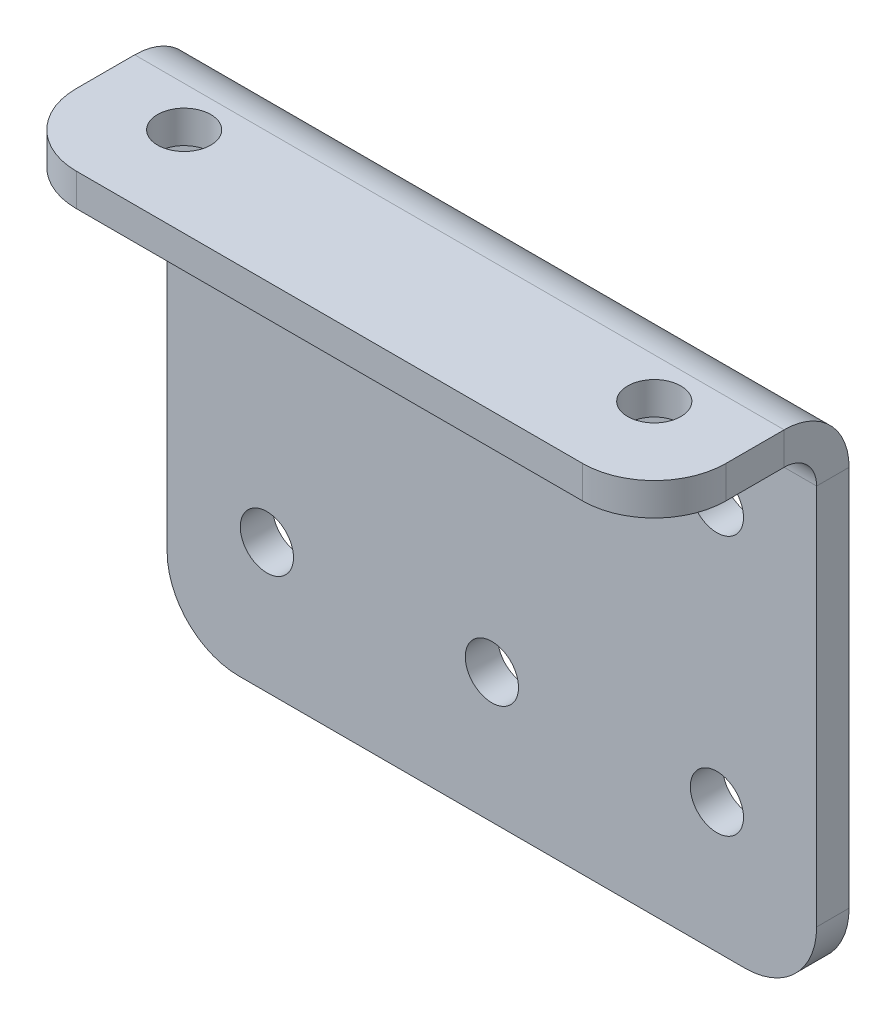
ISO-10303-21;
HEADER;
FILE_DESCRIPTION(('STEP AP214'),'2;1');
FILE_NAME('part.step','',(''),(''),'','','');
FILE_SCHEMA(('AUTOMOTIVE_DESIGN { 1 0 10303 214 1 1 1 1 }'));
ENDSEC;
DATA;
#1=APPLICATION_CONTEXT('core data for automotive mechanical design processes');
#2=APPLICATION_PROTOCOL_DEFINITION('international standard','automotive_design',2000,#1);
#3=PRODUCT_CONTEXT('',#1,'mechanical');
#4=PRODUCT('Part','Part','',(#3));
#5=PRODUCT_RELATED_PRODUCT_CATEGORY('part','',(#4));
#6=PRODUCT_DEFINITION_FORMATION('','',#4);
#7=PRODUCT_DEFINITION_CONTEXT('part definition',#1,'design');
#8=PRODUCT_DEFINITION('design','',#6,#7);
#9=PRODUCT_DEFINITION_SHAPE('','',#8);
#10=(LENGTH_UNIT() NAMED_UNIT(*) SI_UNIT(.MILLI.,.METRE.));
#11=(NAMED_UNIT(*) PLANE_ANGLE_UNIT() SI_UNIT($,.RADIAN.));
#12=(NAMED_UNIT(*) SI_UNIT($,.STERADIAN.) SOLID_ANGLE_UNIT());
#13=UNCERTAINTY_MEASURE_WITH_UNIT(LENGTH_MEASURE(1.E-05),#10,'distance_accuracy_value','');
#14=(GEOMETRIC_REPRESENTATION_CONTEXT(3) GLOBAL_UNCERTAINTY_ASSIGNED_CONTEXT((#13)) GLOBAL_UNIT_ASSIGNED_CONTEXT((#10,
#11,#12)) REPRESENTATION_CONTEXT('',''));
#15=CARTESIAN_POINT('',(0.,0.,0.));
#16=DIRECTION('',(0.,0.,1.));
#17=DIRECTION('',(1.,0.,0.));
#18=AXIS2_PLACEMENT_3D('',#15,#16,#17);
#19=CARTESIAN_POINT('',(-393.7,22.104996867082,0.));
#20=DIRECTION('',(1.,0.,0.));
#21=DIRECTION('',(0.,0.,-1.));
#22=AXIS2_PLACEMENT_3D('',#19,#20,#21);
#23=PLANE('',#22);
#24=DIRECTION('',(0.,-1.,0.));
#25=VECTOR('',#24,1.);
#26=CARTESIAN_POINT('',(-393.7,22.104996867082,6.35));
#27=LINE('',#26,#25);
#28=CARTESIAN_POINT('',(-393.7,25.279996867082,6.35));
#29=VERTEX_POINT('',#28);
#30=CARTESIAN_POINT('',(-393.7,22.104996867082,6.35));
#31=VERTEX_POINT('',#30);
#32=EDGE_CURVE('E11',#29,#31,#27,.T.);
#33=ORIENTED_EDGE('',*,*,#32,.F.);
#34=DIRECTION('',(0.,0.,1.));
#35=VECTOR('',#34,1.);
#36=CARTESIAN_POINT('',(-393.7,25.279996867082,0.));
#37=LINE('',#36,#35);
#38=CARTESIAN_POINT('',(-393.7,25.279996867082,12.05));
#39=VERTEX_POINT('',#38);
#40=EDGE_CURVE('E113',#39,#29,#37,.F.);
#41=ORIENTED_EDGE('',*,*,#40,.F.);
#42=DIRECTION('',(0.,-1.,0.));
#43=VECTOR('',#42,1.);
#44=CARTESIAN_POINT('',(-393.7,22.104996867082,12.05));
#45=LINE('',#44,#43);
#46=CARTESIAN_POINT('',(-393.7,22.104996867082,12.05));
#47=VERTEX_POINT('',#46);
#48=EDGE_CURVE('E60',#39,#47,#45,.T.);
#49=ORIENTED_EDGE('',*,*,#48,.T.);
#50=DIRECTION('',(0.,0.,-1.));
#51=VECTOR('',#50,1.);
#52=CARTESIAN_POINT('',(-393.7,22.104996867082,0.));
#53=LINE('',#52,#51);
#54=EDGE_CURVE('E116',#47,#31,#53,.T.);
#55=ORIENTED_EDGE('',*,*,#54,.T.);
#56=EDGE_LOOP('',(#33,#41,#49,#55));
#57=FACE_BOUND('',#56,.T.);
#58=ADVANCED_FACE('F49',(#57),#23,.T.);
#59=CARTESIAN_POINT('',(-400.7,22.104996867082,12.05));
#60=DIRECTION('',(0.,1.,0.));
#61=DIRECTION('',(-1.,0.,0.));
#62=AXIS2_PLACEMENT_3D('',#59,#60,#61);
#63=CYLINDRICAL_SURFACE('',#62,7.);
#64=ORIENTED_EDGE('',*,*,#48,.F.);
#65=CARTESIAN_POINT('',(-400.7,25.279996867082,12.05));
#66=DIRECTION('',(0.,1.,0.));
#67=DIRECTION('',(-1.,0.,0.));
#68=AXIS2_PLACEMENT_3D('',#65,#66,#67);
#69=CIRCLE('',#68,7.);
#70=CARTESIAN_POINT('',(-400.7,25.279996867082,19.05));
#71=VERTEX_POINT('',#70);
#72=EDGE_CURVE('E142',#39,#71,#69,.F.);
#73=ORIENTED_EDGE('',*,*,#72,.T.);
#74=DIRECTION('',(0.,-1.,0.));
#75=VECTOR('',#74,1.);
#76=CARTESIAN_POINT('',(-400.7,22.104996867082,19.05));
#77=LINE('',#76,#75);
#78=CARTESIAN_POINT('',(-400.7,22.104996867082,19.05));
#79=VERTEX_POINT('',#78);
#80=EDGE_CURVE('E195',#71,#79,#77,.T.);
#81=ORIENTED_EDGE('',*,*,#80,.T.);
#82=CARTESIAN_POINT('',(-400.7,22.104996867082,12.05));
#83=DIRECTION('',(0.,1.,0.));
#84=DIRECTION('',(-1.,0.,0.));
#85=AXIS2_PLACEMENT_3D('',#82,#83,#84);
#86=CIRCLE('',#85,7.);
#87=EDGE_CURVE('E281',#47,#79,#86,.F.);
#88=ORIENTED_EDGE('',*,*,#87,.F.);
#89=EDGE_LOOP('',(#64,#73,#81,#88));
#90=FACE_BOUND('',#89,.T.);
#91=ADVANCED_FACE('F276',(#90),#63,.T.);
#92=CARTESIAN_POINT('',(-457.2,22.104996867082,19.05));
#93=DIRECTION('',(0.,0.,1.));
#94=DIRECTION('',(1.,0.,0.));
#95=AXIS2_PLACEMENT_3D('',#92,#93,#94);
#96=PLANE('',#95);
#97=ORIENTED_EDGE('',*,*,#80,.F.);
#98=DIRECTION('',(-1.,0.,0.));
#99=VECTOR('',#98,1.);
#100=CARTESIAN_POINT('',(0.,25.279996867082,19.05));
#101=LINE('',#100,#99);
#102=CARTESIAN_POINT('',(-450.2,25.279996867082,19.05));
#103=VERTEX_POINT('',#102);
#104=EDGE_CURVE('E272',#103,#71,#101,.F.);
#105=ORIENTED_EDGE('',*,*,#104,.F.);
#106=DIRECTION('',(0.,-1.,0.));
#107=VECTOR('',#106,1.);
#108=CARTESIAN_POINT('',(-450.2,22.104996867082,19.05));
#109=LINE('',#108,#107);
#110=CARTESIAN_POINT('',(-450.2,22.104996867082,19.05));
#111=VERTEX_POINT('',#110);
#112=EDGE_CURVE('E191',#103,#111,#109,.T.);
#113=ORIENTED_EDGE('',*,*,#112,.T.);
#114=DIRECTION('',(1.,0.,0.));
#115=VECTOR('',#114,1.);
#116=CARTESIAN_POINT('',(-457.2,22.104996867082,19.05));
#117=LINE('',#116,#115);
#118=EDGE_CURVE('E295',#111,#79,#117,.T.);
#119=ORIENTED_EDGE('',*,*,#118,.T.);
#120=EDGE_LOOP('',(#97,#105,#113,#119));
#121=FACE_BOUND('',#120,.T.);
#122=ADVANCED_FACE('F395',(#121),#96,.T.);
#123=CARTESIAN_POINT('',(-450.2,22.104996867082,12.05));
#124=DIRECTION('',(0.,1.,0.));
#125=DIRECTION('',(-1.,0.,0.));
#126=AXIS2_PLACEMENT_3D('',#123,#124,#125);
#127=CYLINDRICAL_SURFACE('',#126,7.);
#128=ORIENTED_EDGE('',*,*,#112,.F.);
#129=CARTESIAN_POINT('',(-450.2,25.279996867082,12.05));
#130=DIRECTION('',(0.,1.,0.));
#131=DIRECTION('',(-1.,0.,0.));
#132=AXIS2_PLACEMENT_3D('',#129,#130,#131);
#133=CIRCLE('',#132,7.);
#134=CARTESIAN_POINT('',(-457.2,25.279996867082,12.05));
#135=VERTEX_POINT('',#134);
#136=EDGE_CURVE('E268',#103,#135,#133,.F.);
#137=ORIENTED_EDGE('',*,*,#136,.T.);
#138=DIRECTION('',(0.,-1.,0.));
#139=VECTOR('',#138,1.);
#140=CARTESIAN_POINT('',(-457.2,22.104996867082,12.05));
#141=LINE('',#140,#139);
#142=CARTESIAN_POINT('',(-457.2,22.104996867082,12.05));
#143=VERTEX_POINT('',#142);
#144=EDGE_CURVE('E187',#135,#143,#141,.T.);
#145=ORIENTED_EDGE('',*,*,#144,.T.);
#146=CARTESIAN_POINT('',(-450.2,22.104996867082,12.05));
#147=DIRECTION('',(0.,1.,0.));
#148=DIRECTION('',(-1.,0.,0.));
#149=AXIS2_PLACEMENT_3D('',#146,#147,#148);
#150=CIRCLE('',#149,7.);
#151=EDGE_CURVE('E304',#111,#143,#150,.F.);
#152=ORIENTED_EDGE('',*,*,#151,.F.);
#153=EDGE_LOOP('',(#128,#137,#145,#152));
#154=FACE_BOUND('',#153,.T.);
#155=ADVANCED_FACE('F357',(#154),#127,.T.);
#156=CARTESIAN_POINT('',(-457.2,22.104996867082,0.));
#157=DIRECTION('',(-1.,0.,0.));
#158=DIRECTION('',(0.,0.,1.));
#159=AXIS2_PLACEMENT_3D('',#156,#157,#158);
#160=PLANE('',#159);
#161=ORIENTED_EDGE('',*,*,#144,.F.);
#162=DIRECTION('',(0.,0.,1.));
#163=VECTOR('',#162,1.);
#164=CARTESIAN_POINT('',(-457.2,25.279996867082,0.));
#165=LINE('',#164,#163);
#166=CARTESIAN_POINT('',(-457.2,25.279996867082,6.35));
#167=VERTEX_POINT('',#166);
#168=EDGE_CURVE('E264',#167,#135,#165,.T.);
#169=ORIENTED_EDGE('',*,*,#168,.F.);
#170=DIRECTION('',(0.,-1.,0.));
#171=VECTOR('',#170,1.);
#172=CARTESIAN_POINT('',(-457.2,22.104996867082,6.35));
#173=LINE('',#172,#171);
#174=CARTESIAN_POINT('',(-457.2,22.104996867082,6.35));
#175=VERTEX_POINT('',#174);
#176=EDGE_CURVE('E183',#167,#175,#173,.T.);
#177=ORIENTED_EDGE('',*,*,#176,.T.);
#178=DIRECTION('',(0.,0.,1.));
#179=VECTOR('',#178,1.);
#180=CARTESIAN_POINT('',(-457.2,22.104996867082,0.));
#181=LINE('',#180,#179);
#182=EDGE_CURVE('E308',#175,#143,#181,.T.);
#183=ORIENTED_EDGE('',*,*,#182,.T.);
#184=EDGE_LOOP('',(#161,#169,#177,#183));
#185=FACE_BOUND('',#184,.T.);
#186=ADVANCED_FACE('F350',(#185),#160,.T.);
#187=CARTESIAN_POINT('',(-457.2,18.929996867082,6.35));
#188=DIRECTION('',(1.,0.,0.));
#189=DIRECTION('',(0.,0.,-1.));
#190=AXIS2_PLACEMENT_3D('',#187,#188,#189);
#191=PLANE('',#190);
#192=ORIENTED_EDGE('',*,*,#176,.F.);
#193=CARTESIAN_POINT('',(-457.2,18.929996867082,6.35));
#194=DIRECTION('',(-1.,0.,0.));
#195=DIRECTION('',(0.,-1.,0.));
#196=AXIS2_PLACEMENT_3D('',#193,#194,#195);
#197=CIRCLE('',#196,6.35);
#198=CARTESIAN_POINT('',(-457.2,18.9299968670821,0.));
#199=VERTEX_POINT('',#198);
#200=EDGE_CURVE('E130',#167,#199,#197,.T.);
#201=ORIENTED_EDGE('',*,*,#200,.T.);
#202=DIRECTION('',(0.,0.,1.));
#203=VECTOR('',#202,1.);
#204=CARTESIAN_POINT('',(-457.2,18.929996867082,3.175));
#205=LINE('',#204,#203);
#206=CARTESIAN_POINT('',(-457.2,18.929996867082,3.175));
#207=VERTEX_POINT('',#206);
#208=EDGE_CURVE('E180',#199,#207,#205,.T.);
#209=ORIENTED_EDGE('',*,*,#208,.T.);
#210=CARTESIAN_POINT('',(-457.2,18.929996867082,6.35));
#211=DIRECTION('',(-1.,0.,0.));
#212=DIRECTION('',(0.,0.,1.));
#213=AXIS2_PLACEMENT_3D('',#210,#211,#212);
#214=CIRCLE('',#213,3.175);
#215=EDGE_CURVE('E340',#175,#207,#214,.T.);
#216=ORIENTED_EDGE('',*,*,#215,.F.);
#217=EDGE_LOOP('',(#192,#201,#209,#216));
#218=FACE_BOUND('',#217,.T.);
#219=ADVANCED_FACE('F347',(#218),#191,.F.);
#220=CARTESIAN_POINT('',(-457.2,-25.4,3.175));
#221=DIRECTION('',(1.,0.,0.));
#222=DIRECTION('',(0.,-1.,0.));
#223=AXIS2_PLACEMENT_3D('',#220,#221,#222);
#224=PLANE('',#223);
#225=ORIENTED_EDGE('',*,*,#208,.F.);
#226=DIRECTION('',(0.,1.,0.));
#227=VECTOR('',#226,1.);
#228=CARTESIAN_POINT('',(-457.2,0.,0.));
#229=LINE('',#228,#227);
#230=CARTESIAN_POINT('',(-457.2,-18.4,0.));
#231=VERTEX_POINT('',#230);
#232=EDGE_CURVE('E261',#199,#231,#229,.F.);
#233=ORIENTED_EDGE('',*,*,#232,.T.);
#234=DIRECTION('',(0.,0.,1.));
#235=VECTOR('',#234,1.);
#236=CARTESIAN_POINT('',(-457.2,-18.4,3.175));
#237=LINE('',#236,#235);
#238=CARTESIAN_POINT('',(-457.2,-18.4,3.175));
#239=VERTEX_POINT('',#238);
#240=EDGE_CURVE('E176',#231,#239,#237,.T.);
#241=ORIENTED_EDGE('',*,*,#240,.T.);
#242=DIRECTION('',(0.,-1.,0.));
#243=VECTOR('',#242,1.);
#244=CARTESIAN_POINT('',(-457.2,-25.4,3.175));
#245=LINE('',#244,#243);
#246=EDGE_CURVE('E312',#207,#239,#245,.T.);
#247=ORIENTED_EDGE('',*,*,#246,.F.);
#248=EDGE_LOOP('',(#225,#233,#241,#247));
#249=FACE_BOUND('',#248,.T.);
#250=ADVANCED_FACE('F572',(#249),#224,.F.);
#251=CARTESIAN_POINT('',(-450.2,-18.4,3.175));
#252=DIRECTION('',(0.,0.,-1.));
#253=DIRECTION('',(-1.,0.,0.));
#254=AXIS2_PLACEMENT_3D('',#251,#252,#253);
#255=CYLINDRICAL_SURFACE('',#254,7.);
#256=ORIENTED_EDGE('',*,*,#240,.F.);
#257=CARTESIAN_POINT('',(-450.2,-18.4,0.));
#258=DIRECTION('',(0.,0.,-1.));
#259=DIRECTION('',(-1.,0.,0.));
#260=AXIS2_PLACEMENT_3D('',#257,#258,#259);
#261=CIRCLE('',#260,7.);
#262=CARTESIAN_POINT('',(-450.2,-25.4,0.));
#263=VERTEX_POINT('',#262);
#264=EDGE_CURVE('E257',#231,#263,#261,.F.);
#265=ORIENTED_EDGE('',*,*,#264,.T.);
#266=DIRECTION('',(0.,0.,1.));
#267=VECTOR('',#266,1.);
#268=CARTESIAN_POINT('',(-450.2,-25.4,3.175));
#269=LINE('',#268,#267);
#270=CARTESIAN_POINT('',(-450.2,-25.4,3.175));
#271=VERTEX_POINT('',#270);
#272=EDGE_CURVE('E172',#263,#271,#269,.T.);
#273=ORIENTED_EDGE('',*,*,#272,.T.);
#274=CARTESIAN_POINT('',(-450.2,-18.4,3.175));
#275=DIRECTION('',(0.,0.,-1.));
#276=DIRECTION('',(-1.,0.,0.));
#277=AXIS2_PLACEMENT_3D('',#274,#275,#276);
#278=CIRCLE('',#277,7.);
#279=EDGE_CURVE('E316',#239,#271,#278,.F.);
#280=ORIENTED_EDGE('',*,*,#279,.F.);
#281=EDGE_LOOP('',(#256,#265,#273,#280));
#282=FACE_BOUND('',#281,.T.);
#283=ADVANCED_FACE('F639',(#282),#255,.T.);
#284=CARTESIAN_POINT('',(-457.2,-25.4,3.175));
#285=DIRECTION('',(0.,1.,0.));
#286=DIRECTION('',(1.,0.,0.));
#287=AXIS2_PLACEMENT_3D('',#284,#285,#286);
#288=PLANE('',#287);
#289=ORIENTED_EDGE('',*,*,#272,.F.);
#290=DIRECTION('',(-1.,0.,0.));
#291=VECTOR('',#290,1.);
#292=CARTESIAN_POINT('',(0.,-25.4,0.));
#293=LINE('',#292,#291);
#294=CARTESIAN_POINT('',(-400.7,-25.4,0.));
#295=VERTEX_POINT('',#294);
#296=EDGE_CURVE('E251',#263,#295,#293,.F.);
#297=ORIENTED_EDGE('',*,*,#296,.T.);
#298=DIRECTION('',(0.,0.,1.));
#299=VECTOR('',#298,1.);
#300=CARTESIAN_POINT('',(-400.7,-25.4,3.175));
#301=LINE('',#300,#299);
#302=CARTESIAN_POINT('',(-400.7,-25.4,3.175));
#303=VERTEX_POINT('',#302);
#304=EDGE_CURVE('E168',#295,#303,#301,.T.);
#305=ORIENTED_EDGE('',*,*,#304,.T.);
#306=DIRECTION('',(1.,0.,0.));
#307=VECTOR('',#306,1.);
#308=CARTESIAN_POINT('',(-457.2,-25.4,3.175));
#309=LINE('',#308,#307);
#310=EDGE_CURVE('E320',#271,#303,#309,.T.);
#311=ORIENTED_EDGE('',*,*,#310,.F.);
#312=EDGE_LOOP('',(#289,#297,#305,#311));
#313=FACE_BOUND('',#312,.T.);
#314=ADVANCED_FACE('F387',(#313),#288,.F.);
#315=CARTESIAN_POINT('',(-400.7,-18.4,3.175));
#316=DIRECTION('',(0.,0.,-1.));
#317=DIRECTION('',(-1.,0.,0.));
#318=AXIS2_PLACEMENT_3D('',#315,#316,#317);
#319=CYLINDRICAL_SURFACE('',#318,7.);
#320=ORIENTED_EDGE('',*,*,#304,.F.);
#321=CARTESIAN_POINT('',(-400.7,-18.4,0.));
#322=DIRECTION('',(0.,0.,-1.));
#323=DIRECTION('',(-1.,0.,0.));
#324=AXIS2_PLACEMENT_3D('',#321,#322,#323);
#325=CIRCLE('',#324,7.);
#326=CARTESIAN_POINT('',(-393.7,-18.4,0.));
#327=VERTEX_POINT('',#326);
#328=EDGE_CURVE('E245',#295,#327,#325,.F.);
#329=ORIENTED_EDGE('',*,*,#328,.T.);
#330=DIRECTION('',(0.,0.,1.));
#331=VECTOR('',#330,1.);
#332=CARTESIAN_POINT('',(-393.7,-18.4,3.175));
#333=LINE('',#332,#331);
#334=CARTESIAN_POINT('',(-393.7,-18.4,3.175));
#335=VERTEX_POINT('',#334);
#336=EDGE_CURVE('E164',#327,#335,#333,.T.);
#337=ORIENTED_EDGE('',*,*,#336,.T.);
#338=CARTESIAN_POINT('',(-400.7,-18.4,3.175));
#339=DIRECTION('',(0.,0.,-1.));
#340=DIRECTION('',(-1.,0.,0.));
#341=AXIS2_PLACEMENT_3D('',#338,#339,#340);
#342=CIRCLE('',#341,7.);
#343=EDGE_CURVE('E324',#303,#335,#342,.F.);
#344=ORIENTED_EDGE('',*,*,#343,.F.);
#345=EDGE_LOOP('',(#320,#329,#337,#344));
#346=FACE_BOUND('',#345,.T.);
#347=ADVANCED_FACE('F373',(#346),#319,.T.);
#348=CARTESIAN_POINT('',(-393.7,-25.4,3.175));
#349=DIRECTION('',(-1.,0.,0.));
#350=DIRECTION('',(0.,1.,0.));
#351=AXIS2_PLACEMENT_3D('',#348,#349,#350);
#352=PLANE('',#351);
#353=ORIENTED_EDGE('',*,*,#336,.F.);
#354=DIRECTION('',(0.,1.,0.));
#355=VECTOR('',#354,1.);
#356=CARTESIAN_POINT('',(-393.7,0.,0.));
#357=LINE('',#356,#355);
#358=CARTESIAN_POINT('',(-393.7,18.929996867082,0.));
#359=VERTEX_POINT('',#358);
#360=EDGE_CURVE('E136',#327,#359,#357,.T.);
#361=ORIENTED_EDGE('',*,*,#360,.T.);
#362=DIRECTION('',(0.,0.,1.));
#363=VECTOR('',#362,1.);
#364=CARTESIAN_POINT('',(-393.7,18.929996867082,3.175));
#365=LINE('',#364,#363);
#366=CARTESIAN_POINT('',(-393.7,18.929996867082,3.175));
#367=VERTEX_POINT('',#366);
#368=EDGE_CURVE('E69',#359,#367,#365,.T.);
#369=ORIENTED_EDGE('',*,*,#368,.T.);
#370=DIRECTION('',(0.,1.,0.));
#371=VECTOR('',#370,1.);
#372=CARTESIAN_POINT('',(-393.7,-25.4,3.175));
#373=LINE('',#372,#371);
#374=EDGE_CURVE('E328',#335,#367,#373,.T.);
#375=ORIENTED_EDGE('',*,*,#374,.F.);
#376=EDGE_LOOP('',(#353,#361,#369,#375));
#377=FACE_BOUND('',#376,.T.);
#378=ADVANCED_FACE('F378',(#377),#352,.F.);
#379=CARTESIAN_POINT('',(-402.469029611437,22.104996867082,10.2809703885628));
#380=DIRECTION('',(0.,1.,0.));
#381=DIRECTION('',(-1.,0.,0.));
#382=AXIS2_PLACEMENT_3D('',#379,#380,#381);
#383=CYLINDRICAL_SURFACE('',#382,2.60000000000002);
#384=CARTESIAN_POINT('',(-402.469029611437,22.104996867082,10.2809703885628));
#385=DIRECTION('',(0.,-1.,0.));
#386=DIRECTION('',(1.,0.,0.));
#387=AXIS2_PLACEMENT_3D('',#384,#385,#386);
#388=CIRCLE('',#387,2.60000000000002);
#389=CARTESIAN_POINT('',(-399.869029611437,22.104996867082,10.2809703885628));
#390=VERTEX_POINT('',#389);
#391=EDGE_CURVE('E298',#390,#390,#388,.T.);
#392=ORIENTED_EDGE('',*,*,#391,.T.);
#393=EDGE_LOOP('',(#392));
#394=FACE_BOUND('',#393,.T.);
#395=CARTESIAN_POINT('',(-402.469029611437,25.279996867082,10.2809703885628));
#396=DIRECTION('',(0.,-1.,0.));
#397=DIRECTION('',(1.,0.,0.));
#398=AXIS2_PLACEMENT_3D('',#395,#396,#397);
#399=CIRCLE('',#398,2.60000000000002);
#400=CARTESIAN_POINT('',(-399.869029611437,25.279996867082,10.2809703885628));
#401=VERTEX_POINT('',#400);
#402=EDGE_CURVE('E152',#401,#401,#399,.T.);
#403=ORIENTED_EDGE('',*,*,#402,.F.);
#404=EDGE_LOOP('',(#403));
#405=FACE_BOUND('',#404,.T.);
#406=ADVANCED_FACE('F380',(#394,#405),#383,.F.);
#407=CARTESIAN_POINT('',(-448.430970388563,22.104996867082,10.2809703885627));
#408=DIRECTION('',(0.,1.,0.));
#409=DIRECTION('',(-1.,0.,0.));
#410=AXIS2_PLACEMENT_3D('',#407,#408,#409);
#411=CYLINDRICAL_SURFACE('',#410,2.60000000000002);
#412=CARTESIAN_POINT('',(-448.430970388563,22.104996867082,10.2809703885627));
#413=DIRECTION('',(0.,-1.,0.));
#414=DIRECTION('',(1.,0.,0.));
#415=AXIS2_PLACEMENT_3D('',#412,#413,#414);
#416=CIRCLE('',#415,2.60000000000002);
#417=CARTESIAN_POINT('',(-445.830970388563,22.104996867082,10.2809703885627));
#418=VERTEX_POINT('',#417);
#419=EDGE_CURVE('E291',#418,#418,#416,.T.);
#420=ORIENTED_EDGE('',*,*,#419,.T.);
#421=EDGE_LOOP('',(#420));
#422=FACE_BOUND('',#421,.T.);
#423=CARTESIAN_POINT('',(-448.430970388563,25.279996867082,10.2809703885627));
#424=DIRECTION('',(0.,-1.,0.));
#425=DIRECTION('',(1.,0.,0.));
#426=AXIS2_PLACEMENT_3D('',#423,#424,#425);
#427=CIRCLE('',#426,2.60000000000002);
#428=CARTESIAN_POINT('',(-445.830970388563,25.279996867082,10.2809703885627));
#429=VERTEX_POINT('',#428);
#430=EDGE_CURVE('E144',#429,#429,#427,.T.);
#431=ORIENTED_EDGE('',*,*,#430,.F.);
#432=EDGE_LOOP('',(#431));
#433=FACE_BOUND('',#432,.T.);
#434=ADVANCED_FACE('F51',(#422,#433),#411,.F.);
#435=CARTESIAN_POINT('',(-393.7,18.929996867082,6.35));
#436=DIRECTION('',(-1.,0.,0.));
#437=DIRECTION('',(0.,0.,1.));
#438=AXIS2_PLACEMENT_3D('',#435,#436,#437);
#439=PLANE('',#438);
#440=CARTESIAN_POINT('',(-393.7,18.929996867082,6.35));
#441=DIRECTION('',(-1.,0.,0.));
#442=DIRECTION('',(0.,-1.,0.));
#443=AXIS2_PLACEMENT_3D('',#440,#441,#442);
#444=CIRCLE('',#443,6.35);
#445=EDGE_CURVE('E128',#359,#29,#444,.F.);
#446=ORIENTED_EDGE('',*,*,#445,.T.);
#447=ORIENTED_EDGE('',*,*,#32,.T.);
#448=CARTESIAN_POINT('',(-393.7,18.929996867082,6.35));
#449=DIRECTION('',(1.,0.,0.));
#450=DIRECTION('',(0.,0.,-1.));
#451=AXIS2_PLACEMENT_3D('',#448,#449,#450);
#452=CIRCLE('',#451,3.175);
#453=EDGE_CURVE('E337',#367,#31,#452,.T.);
#454=ORIENTED_EDGE('',*,*,#453,.F.);
#455=ORIENTED_EDGE('',*,*,#368,.F.);
#456=EDGE_LOOP('',(#446,#447,#454,#455));
#457=FACE_BOUND('',#456,.T.);
#458=ADVANCED_FACE('F146',(#457),#439,.F.);
#459=CARTESIAN_POINT('',(0.,0.,3.175));
#460=DIRECTION('',(0.,0.,-1.));
#461=DIRECTION('',(-1.,0.,0.));
#462=AXIS2_PLACEMENT_3D('',#459,#460,#461);
#463=PLANE('',#462);
#464=CARTESIAN_POINT('',(-447.45,-12.7,3.175));
#465=DIRECTION('',(0.,0.,1.));
#466=DIRECTION('',(1.,0.,0.));
#467=AXIS2_PLACEMENT_3D('',#464,#465,#466);
#468=CIRCLE('',#467,2.60000000000002);
#469=CARTESIAN_POINT('',(-444.85,-12.7,3.175));
#470=VERTEX_POINT('',#469);
#471=EDGE_CURVE('E472',#470,#470,#468,.T.);
#472=ORIENTED_EDGE('',*,*,#471,.F.);
#473=EDGE_LOOP('',(#472));
#474=FACE_BOUND('',#473,.T.);
#475=CARTESIAN_POINT('',(-425.45,-12.7,3.175));
#476=DIRECTION('',(0.,0.,1.));
#477=DIRECTION('',(1.,0.,0.));
#478=AXIS2_PLACEMENT_3D('',#475,#476,#477);
#479=CIRCLE('',#478,2.60000000000002);
#480=CARTESIAN_POINT('',(-422.85,-12.7,3.175));
#481=VERTEX_POINT('',#480);
#482=EDGE_CURVE('E468',#481,#481,#479,.T.);
#483=ORIENTED_EDGE('',*,*,#482,.F.);
#484=EDGE_LOOP('',(#483));
#485=FACE_BOUND('',#484,.T.);
#486=CARTESIAN_POINT('',(-403.45,-12.7,3.175));
#487=DIRECTION('',(0.,0.,1.));
#488=DIRECTION('',(1.,0.,0.));
#489=AXIS2_PLACEMENT_3D('',#486,#487,#488);
#490=CIRCLE('',#489,2.60000000000002);
#491=CARTESIAN_POINT('',(-400.85,-12.7,3.175));
#492=VERTEX_POINT('',#491);
#493=EDGE_CURVE('E462',#492,#492,#490,.T.);
#494=ORIENTED_EDGE('',*,*,#493,.F.);
#495=EDGE_LOOP('',(#494));
#496=FACE_BOUND('',#495,.T.);
#497=CARTESIAN_POINT('',(-403.45,12.7,3.175));
#498=DIRECTION('',(0.,0.,1.));
#499=DIRECTION('',(1.,0.,0.));
#500=AXIS2_PLACEMENT_3D('',#497,#498,#499);
#501=CIRCLE('',#500,2.60000000000002);
#502=CARTESIAN_POINT('',(-400.85,12.7,3.175));
#503=VERTEX_POINT('',#502);
#504=EDGE_CURVE('E455',#503,#503,#501,.T.);
#505=ORIENTED_EDGE('',*,*,#504,.F.);
#506=EDGE_LOOP('',(#505));
#507=FACE_BOUND('',#506,.T.);
#508=CARTESIAN_POINT('',(-425.45,12.7,3.175));
#509=DIRECTION('',(0.,0.,1.));
#510=DIRECTION('',(1.,0.,0.));
#511=AXIS2_PLACEMENT_3D('',#508,#509,#510);
#512=CIRCLE('',#511,2.60000000000002);
#513=CARTESIAN_POINT('',(-422.85,12.7,3.175));
#514=VERTEX_POINT('',#513);
#515=EDGE_CURVE('E452',#514,#514,#512,.T.);
#516=ORIENTED_EDGE('',*,*,#515,.F.);
#517=EDGE_LOOP('',(#516));
#518=FACE_BOUND('',#517,.T.);
#519=CARTESIAN_POINT('',(-447.45,12.7,3.175));
#520=DIRECTION('',(0.,0.,1.));
#521=DIRECTION('',(1.,0.,0.));
#522=AXIS2_PLACEMENT_3D('',#519,#520,#521);
#523=CIRCLE('',#522,2.60000000000002);
#524=CARTESIAN_POINT('',(-444.85,12.7,3.175));
#525=VERTEX_POINT('',#524);
#526=EDGE_CURVE('E209',#525,#525,#523,.T.);
#527=ORIENTED_EDGE('',*,*,#526,.F.);
#528=EDGE_LOOP('',(#527));
#529=FACE_BOUND('',#528,.T.);
#530=ORIENTED_EDGE('',*,*,#374,.T.);
#531=DIRECTION('',(1.,0.,0.));
#532=VECTOR('',#531,1.);
#533=CARTESIAN_POINT('',(-457.2,18.929996867082,3.175));
#534=LINE('',#533,#532);
#535=EDGE_CURVE('E203',#367,#207,#534,.F.);
#536=ORIENTED_EDGE('',*,*,#535,.T.);
#537=ORIENTED_EDGE('',*,*,#246,.T.);
#538=ORIENTED_EDGE('',*,*,#279,.T.);
#539=ORIENTED_EDGE('',*,*,#310,.T.);
#540=ORIENTED_EDGE('',*,*,#343,.T.);
#541=EDGE_LOOP('',(#530,#536,#537,#538,#539,#540));
#542=FACE_BOUND('',#541,.T.);
#543=ADVANCED_FACE('F375',(#474,#485,#496,#507,#518,#529,#542),#463,.F.);
#544=CARTESIAN_POINT('',(0.,22.104996867082,0.));
#545=DIRECTION('',(0.,1.,0.));
#546=DIRECTION('',(-1.,0.,0.));
#547=AXIS2_PLACEMENT_3D('',#544,#545,#546);
#548=PLANE('',#547);
#549=ORIENTED_EDGE('',*,*,#391,.F.);
#550=EDGE_LOOP('',(#549));
#551=FACE_BOUND('',#550,.T.);
#552=ORIENTED_EDGE('',*,*,#419,.F.);
#553=EDGE_LOOP('',(#552));
#554=FACE_BOUND('',#553,.T.);
#555=ORIENTED_EDGE('',*,*,#182,.F.);
#556=DIRECTION('',(1.,0.,0.));
#557=VECTOR('',#556,1.);
#558=CARTESIAN_POINT('',(-393.7,22.104996867082,6.35));
#559=LINE('',#558,#557);
#560=EDGE_CURVE('E289',#175,#31,#559,.T.);
#561=ORIENTED_EDGE('',*,*,#560,.T.);
#562=ORIENTED_EDGE('',*,*,#54,.F.);
#563=ORIENTED_EDGE('',*,*,#87,.T.);
#564=ORIENTED_EDGE('',*,*,#118,.F.);
#565=ORIENTED_EDGE('',*,*,#151,.T.);
#566=EDGE_LOOP('',(#555,#561,#562,#563,#564,#565));
#567=FACE_BOUND('',#566,.T.);
#568=ADVANCED_FACE('F285',(#551,#554,#567),#548,.F.);
#569=CARTESIAN_POINT('',(0.,18.929996867082,6.35));
#570=DIRECTION('',(-1.,0.,0.));
#571=DIRECTION('',(0.,-1.,0.));
#572=AXIS2_PLACEMENT_3D('',#569,#570,#571);
#573=CYLINDRICAL_SURFACE('',#572,3.175);
#574=ORIENTED_EDGE('',*,*,#215,.T.);
#575=ORIENTED_EDGE('',*,*,#535,.F.);
#576=ORIENTED_EDGE('',*,*,#453,.T.);
#577=ORIENTED_EDGE('',*,*,#560,.F.);
#578=EDGE_LOOP('',(#574,#575,#576,#577));
#579=FACE_BOUND('',#578,.T.);
#580=ADVANCED_FACE('F230',(#579),#573,.F.);
#581=CARTESIAN_POINT('',(0.,0.,0.));
#582=DIRECTION('',(0.,0.,-1.));
#583=DIRECTION('',(-1.,0.,0.));
#584=AXIS2_PLACEMENT_3D('',#581,#582,#583);
#585=PLANE('',#584);
#586=CARTESIAN_POINT('',(-447.45,-12.7,0.));
#587=DIRECTION('',(0.,0.,-1.));
#588=DIRECTION('',(-1.,0.,0.));
#589=AXIS2_PLACEMENT_3D('',#586,#587,#588);
#590=CIRCLE('',#589,2.60000000000002);
#591=CARTESIAN_POINT('',(-450.05,-12.7,0.));
#592=VERTEX_POINT('',#591);
#593=EDGE_CURVE('E53',#592,#592,#590,.T.);
#594=ORIENTED_EDGE('',*,*,#593,.F.);
#595=EDGE_LOOP('',(#594));
#596=FACE_BOUND('',#595,.T.);
#597=CARTESIAN_POINT('',(-425.45,-12.7,0.));
#598=DIRECTION('',(0.,0.,-1.));
#599=DIRECTION('',(-1.,0.,0.));
#600=AXIS2_PLACEMENT_3D('',#597,#598,#599);
#601=CIRCLE('',#600,2.60000000000002);
#602=CARTESIAN_POINT('',(-428.05,-12.7,0.));
#603=VERTEX_POINT('',#602);
#604=EDGE_CURVE('E155',#603,#603,#601,.T.);
#605=ORIENTED_EDGE('',*,*,#604,.F.);
#606=EDGE_LOOP('',(#605));
#607=FACE_BOUND('',#606,.T.);
#608=CARTESIAN_POINT('',(-403.45,-12.7,0.));
#609=DIRECTION('',(0.,0.,-1.));
#610=DIRECTION('',(-1.,0.,0.));
#611=AXIS2_PLACEMENT_3D('',#608,#609,#610);
#612=CIRCLE('',#611,2.60000000000002);
#613=CARTESIAN_POINT('',(-406.05,-12.7,0.));
#614=VERTEX_POINT('',#613);
#615=EDGE_CURVE('E217',#614,#614,#612,.T.);
#616=ORIENTED_EDGE('',*,*,#615,.F.);
#617=EDGE_LOOP('',(#616));
#618=FACE_BOUND('',#617,.T.);
#619=CARTESIAN_POINT('',(-403.45,12.7,0.));
#620=DIRECTION('',(0.,0.,-1.));
#621=DIRECTION('',(-1.,0.,0.));
#622=AXIS2_PLACEMENT_3D('',#619,#620,#621);
#623=CIRCLE('',#622,2.60000000000002);
#624=CARTESIAN_POINT('',(-406.05,12.7,0.));
#625=VERTEX_POINT('',#624);
#626=EDGE_CURVE('E213',#625,#625,#623,.T.);
#627=ORIENTED_EDGE('',*,*,#626,.F.);
#628=EDGE_LOOP('',(#627));
#629=FACE_BOUND('',#628,.T.);
#630=CARTESIAN_POINT('',(-425.45,12.7,0.));
#631=DIRECTION('',(0.,0.,-1.));
#632=DIRECTION('',(-1.,0.,0.));
#633=AXIS2_PLACEMENT_3D('',#630,#631,#632);
#634=CIRCLE('',#633,2.60000000000002);
#635=CARTESIAN_POINT('',(-428.05,12.7,0.));
#636=VERTEX_POINT('',#635);
#637=EDGE_CURVE('E208',#636,#636,#634,.T.);
#638=ORIENTED_EDGE('',*,*,#637,.F.);
#639=EDGE_LOOP('',(#638));
#640=FACE_BOUND('',#639,.T.);
#641=CARTESIAN_POINT('',(-447.45,12.7,0.));
#642=DIRECTION('',(0.,0.,-1.));
#643=DIRECTION('',(-1.,0.,0.));
#644=AXIS2_PLACEMENT_3D('',#641,#642,#643);
#645=CIRCLE('',#644,2.60000000000002);
#646=CARTESIAN_POINT('',(-450.05,12.7,0.));
#647=VERTEX_POINT('',#646);
#648=EDGE_CURVE('E204',#647,#647,#645,.T.);
#649=ORIENTED_EDGE('',*,*,#648,.F.);
#650=EDGE_LOOP('',(#649));
#651=FACE_BOUND('',#650,.T.);
#652=ORIENTED_EDGE('',*,*,#360,.F.);
#653=ORIENTED_EDGE('',*,*,#328,.F.);
#654=ORIENTED_EDGE('',*,*,#296,.F.);
#655=ORIENTED_EDGE('',*,*,#264,.F.);
#656=ORIENTED_EDGE('',*,*,#232,.F.);
#657=DIRECTION('',(-1.,0.,0.));
#658=VECTOR('',#657,1.);
#659=CARTESIAN_POINT('',(0.,18.929996867082,0.));
#660=LINE('',#659,#658);
#661=EDGE_CURVE('E135',#359,#199,#660,.T.);
#662=ORIENTED_EDGE('',*,*,#661,.F.);
#663=EDGE_LOOP('',(#652,#653,#654,#655,#656,#662));
#664=FACE_BOUND('',#663,.T.);
#665=ADVANCED_FACE('F227',(#596,#607,#618,#629,#640,#651,#664),#585,.T.);
#666=CARTESIAN_POINT('',(0.,25.279996867082,0.));
#667=DIRECTION('',(0.,1.,0.));
#668=DIRECTION('',(-1.,0.,0.));
#669=AXIS2_PLACEMENT_3D('',#666,#667,#668);
#670=PLANE('',#669);
#671=ORIENTED_EDGE('',*,*,#402,.T.);
#672=EDGE_LOOP('',(#671));
#673=FACE_BOUND('',#672,.T.);
#674=ORIENTED_EDGE('',*,*,#430,.T.);
#675=EDGE_LOOP('',(#674));
#676=FACE_BOUND('',#675,.T.);
#677=ORIENTED_EDGE('',*,*,#168,.T.);
#678=ORIENTED_EDGE('',*,*,#136,.F.);
#679=ORIENTED_EDGE('',*,*,#104,.T.);
#680=ORIENTED_EDGE('',*,*,#72,.F.);
#681=ORIENTED_EDGE('',*,*,#40,.T.);
#682=DIRECTION('',(-1.,0.,0.));
#683=VECTOR('',#682,1.);
#684=CARTESIAN_POINT('',(0.,25.279996867082,6.35));
#685=LINE('',#684,#683);
#686=EDGE_CURVE('E125',#167,#29,#685,.F.);
#687=ORIENTED_EDGE('',*,*,#686,.F.);
#688=EDGE_LOOP('',(#677,#678,#679,#680,#681,#687));
#689=FACE_BOUND('',#688,.T.);
#690=ADVANCED_FACE('F139',(#673,#676,#689),#670,.T.);
#691=CARTESIAN_POINT('',(0.,18.929996867082,6.35));
#692=DIRECTION('',(-1.,0.,0.));
#693=DIRECTION('',(0.,-1.,0.));
#694=AXIS2_PLACEMENT_3D('',#691,#692,#693);
#695=CYLINDRICAL_SURFACE('',#694,6.35);
#696=ORIENTED_EDGE('',*,*,#200,.F.);
#697=ORIENTED_EDGE('',*,*,#686,.T.);
#698=ORIENTED_EDGE('',*,*,#445,.F.);
#699=ORIENTED_EDGE('',*,*,#661,.T.);
#700=EDGE_LOOP('',(#696,#697,#698,#699));
#701=FACE_BOUND('',#700,.T.);
#702=ADVANCED_FACE('F126',(#701),#695,.T.);
#703=CARTESIAN_POINT('',(-447.45,12.7,-6.825));
#704=DIRECTION('',(0.,0.,1.));
#705=DIRECTION('',(1.,0.,0.));
#706=AXIS2_PLACEMENT_3D('',#703,#704,#705);
#707=CYLINDRICAL_SURFACE('',#706,2.60000000000002);
#708=ORIENTED_EDGE('',*,*,#648,.T.);
#709=EDGE_LOOP('',(#708));
#710=FACE_BOUND('',#709,.T.);
#711=ORIENTED_EDGE('',*,*,#526,.T.);
#712=EDGE_LOOP('',(#711));
#713=FACE_BOUND('',#712,.T.);
#714=ADVANCED_FACE('F421',(#710,#713),#707,.F.);
#715=CARTESIAN_POINT('',(-425.45,12.7,-6.825));
#716=DIRECTION('',(0.,0.,1.));
#717=DIRECTION('',(1.,0.,0.));
#718=AXIS2_PLACEMENT_3D('',#715,#716,#717);
#719=CYLINDRICAL_SURFACE('',#718,2.60000000000002);
#720=ORIENTED_EDGE('',*,*,#637,.T.);
#721=EDGE_LOOP('',(#720));
#722=FACE_BOUND('',#721,.T.);
#723=ORIENTED_EDGE('',*,*,#515,.T.);
#724=EDGE_LOOP('',(#723));
#725=FACE_BOUND('',#724,.T.);
#726=ADVANCED_FACE('F429',(#722,#725),#719,.F.);
#727=CARTESIAN_POINT('',(-403.45,12.7,-6.825));
#728=DIRECTION('',(0.,0.,1.));
#729=DIRECTION('',(1.,0.,0.));
#730=AXIS2_PLACEMENT_3D('',#727,#728,#729);
#731=CYLINDRICAL_SURFACE('',#730,2.60000000000002);
#732=ORIENTED_EDGE('',*,*,#626,.T.);
#733=EDGE_LOOP('',(#732));
#734=FACE_BOUND('',#733,.T.);
#735=ORIENTED_EDGE('',*,*,#504,.T.);
#736=EDGE_LOOP('',(#735));
#737=FACE_BOUND('',#736,.T.);
#738=ADVANCED_FACE('F440',(#734,#737),#731,.F.);
#739=CARTESIAN_POINT('',(-403.45,-12.7,-6.825));
#740=DIRECTION('',(0.,0.,1.));
#741=DIRECTION('',(1.,0.,0.));
#742=AXIS2_PLACEMENT_3D('',#739,#740,#741);
#743=CYLINDRICAL_SURFACE('',#742,2.60000000000002);
#744=ORIENTED_EDGE('',*,*,#615,.T.);
#745=EDGE_LOOP('',(#744));
#746=FACE_BOUND('',#745,.T.);
#747=ORIENTED_EDGE('',*,*,#493,.T.);
#748=EDGE_LOOP('',(#747));
#749=FACE_BOUND('',#748,.T.);
#750=ADVANCED_FACE('F437',(#746,#749),#743,.F.);
#751=CARTESIAN_POINT('',(-425.45,-12.7,-6.825));
#752=DIRECTION('',(0.,0.,1.));
#753=DIRECTION('',(1.,0.,0.));
#754=AXIS2_PLACEMENT_3D('',#751,#752,#753);
#755=CYLINDRICAL_SURFACE('',#754,2.60000000000002);
#756=ORIENTED_EDGE('',*,*,#604,.T.);
#757=EDGE_LOOP('',(#756));
#758=FACE_BOUND('',#757,.T.);
#759=ORIENTED_EDGE('',*,*,#482,.T.);
#760=EDGE_LOOP('',(#759));
#761=FACE_BOUND('',#760,.T.);
#762=ADVANCED_FACE('F224',(#758,#761),#755,.F.);
#763=CARTESIAN_POINT('',(-447.45,-12.7,-6.825));
#764=DIRECTION('',(0.,0.,1.));
#765=DIRECTION('',(1.,0.,0.));
#766=AXIS2_PLACEMENT_3D('',#763,#764,#765);
#767=CYLINDRICAL_SURFACE('',#766,2.60000000000002);
#768=ORIENTED_EDGE('',*,*,#593,.T.);
#769=EDGE_LOOP('',(#768));
#770=FACE_BOUND('',#769,.T.);
#771=ORIENTED_EDGE('',*,*,#471,.T.);
#772=EDGE_LOOP('',(#771));
#773=FACE_BOUND('',#772,.T.);
#774=ADVANCED_FACE('F431',(#770,#773),#767,.F.);
#775=CLOSED_SHELL('',(#58,#91,#122,#155,#186,#219,#250,#283,#314,#347,#378,#406,#434,#458,#543,
#568,#580,#665,#690,#702,#714,#726,#738,#750,#762,#774));
#776=MANIFOLD_SOLID_BREP('B2',#775);
#777=ADVANCED_BREP_SHAPE_REPRESENTATION('',(#18,#776),#14);
#778=SHAPE_DEFINITION_REPRESENTATION(#9,#777);
ENDSEC;
END-ISO-10303-21;
